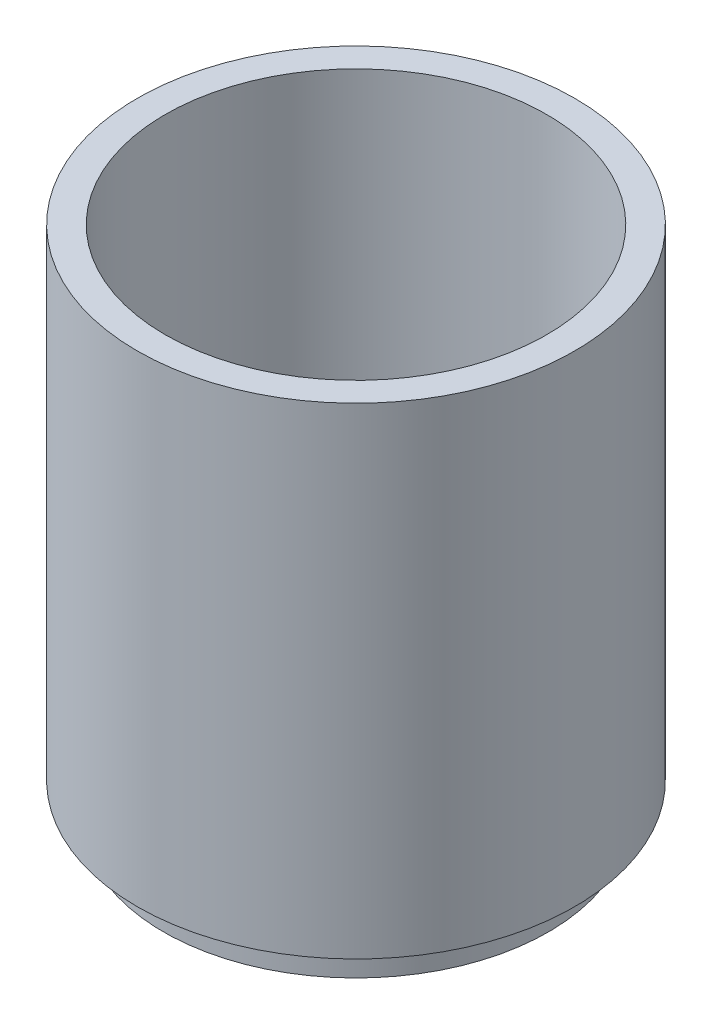
ISO-10303-21;
HEADER;
FILE_DESCRIPTION(('STEP AP214'),'2;1');
FILE_NAME('part.step','',(''),(''),'','','');
FILE_SCHEMA(('AUTOMOTIVE_DESIGN { 1 0 10303 214 1 1 1 1 }'));
ENDSEC;
DATA;
#1=APPLICATION_CONTEXT('core data for automotive mechanical design processes');
#2=APPLICATION_PROTOCOL_DEFINITION('international standard','automotive_design',2000,#1);
#3=PRODUCT_CONTEXT('',#1,'mechanical');
#4=PRODUCT('Part','Part','',(#3));
#5=PRODUCT_RELATED_PRODUCT_CATEGORY('part','',(#4));
#6=PRODUCT_DEFINITION_FORMATION('','',#4);
#7=PRODUCT_DEFINITION_CONTEXT('part definition',#1,'design');
#8=PRODUCT_DEFINITION('design','',#6,#7);
#9=PRODUCT_DEFINITION_SHAPE('','',#8);
#10=(LENGTH_UNIT() NAMED_UNIT(*) SI_UNIT(.MILLI.,.METRE.));
#11=(NAMED_UNIT(*) PLANE_ANGLE_UNIT() SI_UNIT($,.RADIAN.));
#12=(NAMED_UNIT(*) SI_UNIT($,.STERADIAN.) SOLID_ANGLE_UNIT());
#13=UNCERTAINTY_MEASURE_WITH_UNIT(LENGTH_MEASURE(1.E-05),#10,'distance_accuracy_value','');
#14=(GEOMETRIC_REPRESENTATION_CONTEXT(3) GLOBAL_UNCERTAINTY_ASSIGNED_CONTEXT((#13)) GLOBAL_UNIT_ASSIGNED_CONTEXT((#10,
#11,#12)) REPRESENTATION_CONTEXT('',''));
#15=CARTESIAN_POINT('',(0.,0.,0.));
#16=DIRECTION('',(0.,0.,1.));
#17=DIRECTION('',(1.,0.,0.));
#18=AXIS2_PLACEMENT_3D('',#15,#16,#17);
#19=CARTESIAN_POINT('',(0.,69.85,0.));
#20=DIRECTION('',(0.,-1.,0.));
#21=DIRECTION('',(0.,0.,-1.));
#22=AXIS2_PLACEMENT_3D('',#19,#20,#21);
#23=CYLINDRICAL_SURFACE('',#22,31.75);
#24=CARTESIAN_POINT('',(0.,69.85,0.));
#25=DIRECTION('',(0.,1.,0.));
#26=DIRECTION('',(0.,0.,1.));
#27=AXIS2_PLACEMENT_3D('',#24,#25,#26);
#28=CIRCLE('',#27,31.75);
#29=CARTESIAN_POINT('',(0.,69.85,31.75));
#30=VERTEX_POINT('',#29);
#31=EDGE_CURVE('E42',#30,#30,#28,.T.);
#32=ORIENTED_EDGE('',*,*,#31,.F.);
#33=EDGE_LOOP('',(#32));
#34=FACE_BOUND('',#33,.T.);
#35=CARTESIAN_POINT('',(0.,0.,0.));
#36=DIRECTION('',(0.,1.,0.));
#37=DIRECTION('',(0.,0.,1.));
#38=AXIS2_PLACEMENT_3D('',#35,#36,#37);
#39=CIRCLE('',#38,31.75);
#40=CARTESIAN_POINT('',(0.,0.,31.75));
#41=VERTEX_POINT('',#40);
#42=EDGE_CURVE('E38',#41,#41,#39,.T.);
#43=ORIENTED_EDGE('',*,*,#42,.T.);
#44=EDGE_LOOP('',(#43));
#45=FACE_BOUND('',#44,.T.);
#46=ADVANCED_FACE('F35',(#34,#45),#23,.T.);
#47=CARTESIAN_POINT('',(0.,69.85,0.));
#48=DIRECTION('',(0.,1.,0.));
#49=DIRECTION('',(0.,0.,1.));
#50=AXIS2_PLACEMENT_3D('',#47,#48,#49);
#51=PLANE('',#50);
#52=CARTESIAN_POINT('',(0.,69.85,0.));
#53=DIRECTION('',(0.,1.,0.));
#54=DIRECTION('',(0.,0.,1.));
#55=AXIS2_PLACEMENT_3D('',#52,#53,#54);
#56=CIRCLE('',#55,27.686);
#57=CARTESIAN_POINT('',(0.,69.85,27.686));
#58=VERTEX_POINT('',#57);
#59=EDGE_CURVE('E53',#58,#58,#56,.T.);
#60=ORIENTED_EDGE('',*,*,#59,.F.);
#61=EDGE_LOOP('',(#60));
#62=FACE_BOUND('',#61,.T.);
#63=ORIENTED_EDGE('',*,*,#31,.T.);
#64=EDGE_LOOP('',(#63));
#65=FACE_BOUND('',#64,.T.);
#66=ADVANCED_FACE('F75',(#62,#65),#51,.T.);
#67=CARTESIAN_POINT('',(0.,0.,0.));
#68=DIRECTION('',(0.,1.,0.));
#69=DIRECTION('',(0.,0.,1.));
#70=AXIS2_PLACEMENT_3D('',#67,#68,#69);
#71=PLANE('',#70);
#72=CARTESIAN_POINT('',(0.,0.,0.));
#73=DIRECTION('',(0.,-1.,0.));
#74=DIRECTION('',(0.,0.,-1.));
#75=AXIS2_PLACEMENT_3D('',#72,#73,#74);
#76=CIRCLE('',#75,27.94);
#77=CARTESIAN_POINT('',(0.,0.,-27.94));
#78=VERTEX_POINT('',#77);
#79=EDGE_CURVE('E10',#78,#78,#76,.T.);
#80=ORIENTED_EDGE('',*,*,#79,.F.);
#81=EDGE_LOOP('',(#80));
#82=FACE_BOUND('',#81,.T.);
#83=ORIENTED_EDGE('',*,*,#42,.F.);
#84=EDGE_LOOP('',(#83));
#85=FACE_BOUND('',#84,.T.);
#86=ADVANCED_FACE('F80',(#82,#85),#71,.F.);
#87=CARTESIAN_POINT('',(0.,6.34999999999999,0.));
#88=DIRECTION('',(0.,1.,0.));
#89=DIRECTION('',(0.,0.,1.));
#90=AXIS2_PLACEMENT_3D('',#87,#88,#89);
#91=CYLINDRICAL_SURFACE('',#90,27.686);
#92=CARTESIAN_POINT('',(0.,6.34999999999999,0.));
#93=DIRECTION('',(0.,1.,0.));
#94=DIRECTION('',(0.,0.,1.));
#95=AXIS2_PLACEMENT_3D('',#92,#93,#94);
#96=CIRCLE('',#95,27.686);
#97=CARTESIAN_POINT('',(0.,6.34999999999999,27.686));
#98=VERTEX_POINT('',#97);
#99=EDGE_CURVE('E50',#98,#98,#96,.T.);
#100=ORIENTED_EDGE('',*,*,#99,.F.);
#101=EDGE_LOOP('',(#100));
#102=FACE_BOUND('',#101,.T.);
#103=ORIENTED_EDGE('',*,*,#59,.T.);
#104=EDGE_LOOP('',(#103));
#105=FACE_BOUND('',#104,.T.);
#106=ADVANCED_FACE('F71',(#102,#105),#91,.F.);
#107=CARTESIAN_POINT('',(0.,6.34999999999999,0.));
#108=DIRECTION('',(0.,1.,0.));
#109=DIRECTION('',(0.,0.,1.));
#110=AXIS2_PLACEMENT_3D('',#107,#108,#109);
#111=PLANE('',#110);
#112=ORIENTED_EDGE('',*,*,#99,.T.);
#113=EDGE_LOOP('',(#112));
#114=FACE_BOUND('',#113,.T.);
#115=ADVANCED_FACE('F64',(#114),#111,.T.);
#116=CARTESIAN_POINT('',(0.,-5.07999999999999,0.));
#117=DIRECTION('',(0.,1.,0.));
#118=DIRECTION('',(0.,0.,1.));
#119=AXIS2_PLACEMENT_3D('',#116,#117,#118);
#120=CYLINDRICAL_SURFACE('',#119,27.94);
#121=CARTESIAN_POINT('',(0.,-5.07999999999999,0.));
#122=DIRECTION('',(0.,-1.,0.));
#123=DIRECTION('',(0.,0.,-1.));
#124=AXIS2_PLACEMENT_3D('',#121,#122,#123);
#125=CIRCLE('',#124,27.94);
#126=CARTESIAN_POINT('',(0.,-5.07999999999999,-27.94));
#127=VERTEX_POINT('',#126);
#128=EDGE_CURVE('E49',#127,#127,#125,.T.);
#129=ORIENTED_EDGE('',*,*,#128,.F.);
#130=EDGE_LOOP('',(#129));
#131=FACE_BOUND('',#130,.T.);
#132=ORIENTED_EDGE('',*,*,#79,.T.);
#133=EDGE_LOOP('',(#132));
#134=FACE_BOUND('',#133,.T.);
#135=ADVANCED_FACE('F62',(#131,#134),#120,.T.);
#136=CARTESIAN_POINT('',(0.,-5.07999999999999,0.));
#137=DIRECTION('',(0.,-1.,0.));
#138=DIRECTION('',(0.,0.,-1.));
#139=AXIS2_PLACEMENT_3D('',#136,#137,#138);
#140=PLANE('',#139);
#141=ORIENTED_EDGE('',*,*,#128,.T.);
#142=EDGE_LOOP('',(#141));
#143=FACE_BOUND('',#142,.T.);
#144=ADVANCED_FACE('F60',(#143),#140,.T.);
#145=CLOSED_SHELL('',(#46,#66,#86,#106,#115,#135,#144));
#146=MANIFOLD_SOLID_BREP('B2',#145);
#147=ADVANCED_BREP_SHAPE_REPRESENTATION('',(#18,#146),#14);
#148=SHAPE_DEFINITION_REPRESENTATION(#9,#147);
ENDSEC;
END-ISO-10303-21;
